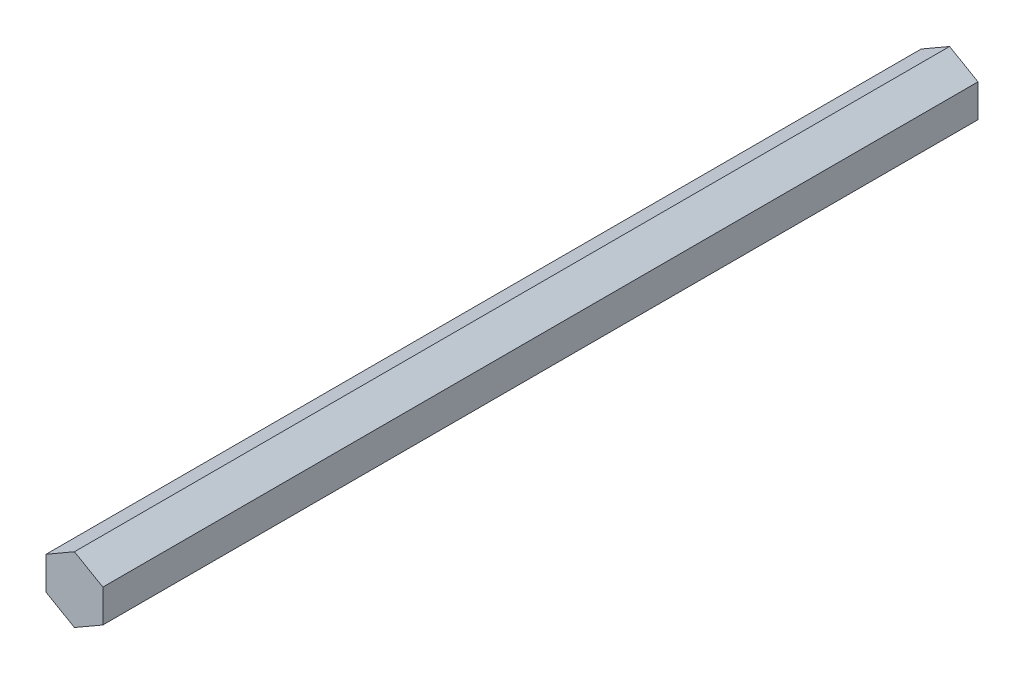
ISO-10303-21;
HEADER;
FILE_DESCRIPTION(('STEP AP214'),'2;1');
FILE_NAME('part.step','',(''),(''),'','','');
FILE_SCHEMA(('AUTOMOTIVE_DESIGN { 1 0 10303 214 1 1 1 1 }'));
ENDSEC;
DATA;
#1=APPLICATION_CONTEXT('core data for automotive mechanical design processes');
#2=APPLICATION_PROTOCOL_DEFINITION('international standard','automotive_design',2000,#1);
#3=PRODUCT_CONTEXT('',#1,'mechanical');
#4=PRODUCT('Part','Part','',(#3));
#5=PRODUCT_RELATED_PRODUCT_CATEGORY('part','',(#4));
#6=PRODUCT_DEFINITION_FORMATION('','',#4);
#7=PRODUCT_DEFINITION_CONTEXT('part definition',#1,'design');
#8=PRODUCT_DEFINITION('design','',#6,#7);
#9=PRODUCT_DEFINITION_SHAPE('','',#8);
#10=(LENGTH_UNIT() NAMED_UNIT(*) SI_UNIT(.MILLI.,.METRE.));
#11=(NAMED_UNIT(*) PLANE_ANGLE_UNIT() SI_UNIT($,.RADIAN.));
#12=(NAMED_UNIT(*) SI_UNIT($,.STERADIAN.) SOLID_ANGLE_UNIT());
#13=UNCERTAINTY_MEASURE_WITH_UNIT(LENGTH_MEASURE(1.E-05),#10,'distance_accuracy_value','');
#14=(GEOMETRIC_REPRESENTATION_CONTEXT(3) GLOBAL_UNCERTAINTY_ASSIGNED_CONTEXT((#13)) GLOBAL_UNIT_ASSIGNED_CONTEXT((#10,
#11,#12)) REPRESENTATION_CONTEXT('',''));
#15=CARTESIAN_POINT('',(0.,0.,0.));
#16=DIRECTION('',(0.,0.,1.));
#17=DIRECTION('',(1.,0.,0.));
#18=AXIS2_PLACEMENT_3D('',#15,#16,#17);
#19=CARTESIAN_POINT('',(1.29903810567665,0.750000000000014,40.));
#20=DIRECTION('',(-0.499999999999995,-0.866025403784442,0.));
#21=DIRECTION('',(0.866025403784442,-0.499999999999995,0.));
#22=AXIS2_PLACEMENT_3D('',#19,#20,#21);
#23=PLANE('',#22);
#24=DIRECTION('',(-0.866025403784442,0.499999999999995,0.));
#25=VECTOR('',#24,1.);
#26=CARTESIAN_POINT('',(1.29903810567665,0.750000000000014,0.));
#27=LINE('',#26,#25);
#28=CARTESIAN_POINT('',(1.29903810567665,0.750000000000014,0.));
#29=VERTEX_POINT('',#28);
#30=CARTESIAN_POINT('',(0.,1.5,0.));
#31=VERTEX_POINT('',#30);
#32=EDGE_CURVE('E123',#29,#31,#27,.T.);
#33=ORIENTED_EDGE('',*,*,#32,.T.);
#34=DIRECTION('',(0.,0.,-1.));
#35=VECTOR('',#34,1.);
#36=CARTESIAN_POINT('',(0.,1.5,40.));
#37=LINE('',#36,#35);
#38=CARTESIAN_POINT('',(0.,1.5,40.));
#39=VERTEX_POINT('',#38);
#40=EDGE_CURVE('E11',#39,#31,#37,.T.);
#41=ORIENTED_EDGE('',*,*,#40,.F.);
#42=DIRECTION('',(-0.866025403784442,0.499999999999995,0.));
#43=VECTOR('',#42,1.);
#44=CARTESIAN_POINT('',(1.29903810567665,0.750000000000014,40.));
#45=LINE('',#44,#43);
#46=CARTESIAN_POINT('',(1.29903810567665,0.750000000000014,40.));
#47=VERTEX_POINT('',#46);
#48=EDGE_CURVE('E133',#47,#39,#45,.T.);
#49=ORIENTED_EDGE('',*,*,#48,.F.);
#50=DIRECTION('',(0.,0.,-1.));
#51=VECTOR('',#50,1.);
#52=CARTESIAN_POINT('',(1.29903810567665,0.750000000000014,40.));
#53=LINE('',#52,#51);
#54=EDGE_CURVE('E119',#47,#29,#53,.T.);
#55=ORIENTED_EDGE('',*,*,#54,.T.);
#56=EDGE_LOOP('',(#33,#41,#49,#55));
#57=FACE_BOUND('',#56,.T.);
#58=ADVANCED_FACE('F39',(#57),#23,.F.);
#59=CARTESIAN_POINT('',(0.,1.5,40.));
#60=DIRECTION('',(0.500000000000001,-0.866025403784438,0.));
#61=DIRECTION('',(0.866025403784438,0.500000000000001,0.));
#62=AXIS2_PLACEMENT_3D('',#59,#60,#61);
#63=PLANE('',#62);
#64=DIRECTION('',(-0.866025403784438,-0.500000000000001,0.));
#65=VECTOR('',#64,1.);
#66=CARTESIAN_POINT('',(0.,1.5,0.));
#67=LINE('',#66,#65);
#68=CARTESIAN_POINT('',(-1.29903810567666,0.749999999999996,0.));
#69=VERTEX_POINT('',#68);
#70=EDGE_CURVE('E126',#31,#69,#67,.T.);
#71=ORIENTED_EDGE('',*,*,#70,.T.);
#72=DIRECTION('',(0.,0.,-1.));
#73=VECTOR('',#72,1.);
#74=CARTESIAN_POINT('',(-1.29903810567666,0.749999999999996,40.));
#75=LINE('',#74,#73);
#76=CARTESIAN_POINT('',(-1.29903810567666,0.749999999999996,40.));
#77=VERTEX_POINT('',#76);
#78=EDGE_CURVE('E47',#77,#69,#75,.T.);
#79=ORIENTED_EDGE('',*,*,#78,.F.);
#80=DIRECTION('',(-0.866025403784438,-0.500000000000001,0.));
#81=VECTOR('',#80,1.);
#82=CARTESIAN_POINT('',(0.,1.5,40.));
#83=LINE('',#82,#81);
#84=EDGE_CURVE('E92',#39,#77,#83,.T.);
#85=ORIENTED_EDGE('',*,*,#84,.F.);
#86=ORIENTED_EDGE('',*,*,#40,.T.);
#87=EDGE_LOOP('',(#71,#79,#85,#86));
#88=FACE_BOUND('',#87,.T.);
#89=ADVANCED_FACE('F157',(#88),#63,.F.);
#90=CARTESIAN_POINT('',(-1.29903810567666,0.749999999999996,40.));
#91=DIRECTION('',(1.,0.,0.));
#92=DIRECTION('',(0.,1.,0.));
#93=AXIS2_PLACEMENT_3D('',#90,#91,#92);
#94=PLANE('',#93);
#95=DIRECTION('',(0.,-1.,0.));
#96=VECTOR('',#95,1.);
#97=CARTESIAN_POINT('',(-1.29903810567666,0.749999999999996,0.));
#98=LINE('',#97,#96);
#99=CARTESIAN_POINT('',(-1.29903810567665,-0.750000000000005,0.));
#100=VERTEX_POINT('',#99);
#101=EDGE_CURVE('E128',#69,#100,#98,.T.);
#102=ORIENTED_EDGE('',*,*,#101,.T.);
#103=DIRECTION('',(0.,0.,-1.));
#104=VECTOR('',#103,1.);
#105=CARTESIAN_POINT('',(-1.29903810567665,-0.750000000000005,40.));
#106=LINE('',#105,#104);
#107=CARTESIAN_POINT('',(-1.29903810567665,-0.750000000000005,40.));
#108=VERTEX_POINT('',#107);
#109=EDGE_CURVE('E114',#108,#100,#106,.T.);
#110=ORIENTED_EDGE('',*,*,#109,.F.);
#111=DIRECTION('',(0.,-1.,0.));
#112=VECTOR('',#111,1.);
#113=CARTESIAN_POINT('',(-1.29903810567666,0.749999999999996,40.));
#114=LINE('',#113,#112);
#115=EDGE_CURVE('E105',#77,#108,#114,.T.);
#116=ORIENTED_EDGE('',*,*,#115,.F.);
#117=ORIENTED_EDGE('',*,*,#78,.T.);
#118=EDGE_LOOP('',(#102,#110,#116,#117));
#119=FACE_BOUND('',#118,.T.);
#120=ADVANCED_FACE('F139',(#119),#94,.F.);
#121=CARTESIAN_POINT('',(-1.29903810567665,-0.750000000000005,40.));
#122=DIRECTION('',(0.499999999999995,0.866025403784442,0.));
#123=DIRECTION('',(-0.866025403784442,0.499999999999995,0.));
#124=AXIS2_PLACEMENT_3D('',#121,#122,#123);
#125=PLANE('',#124);
#126=DIRECTION('',(0.866025403784442,-0.499999999999995,0.));
#127=VECTOR('',#126,1.);
#128=CARTESIAN_POINT('',(-1.29903810567665,-0.750000000000005,0.));
#129=LINE('',#128,#127);
#130=CARTESIAN_POINT('',(0.,-1.5,0.));
#131=VERTEX_POINT('',#130);
#132=EDGE_CURVE('E113',#100,#131,#129,.T.);
#133=ORIENTED_EDGE('',*,*,#132,.T.);
#134=DIRECTION('',(0.,0.,-1.));
#135=VECTOR('',#134,1.);
#136=CARTESIAN_POINT('',(0.,-1.5,40.));
#137=LINE('',#136,#135);
#138=CARTESIAN_POINT('',(0.,-1.5,40.));
#139=VERTEX_POINT('',#138);
#140=EDGE_CURVE('E110',#139,#131,#137,.T.);
#141=ORIENTED_EDGE('',*,*,#140,.F.);
#142=DIRECTION('',(0.866025403784442,-0.499999999999995,0.));
#143=VECTOR('',#142,1.);
#144=CARTESIAN_POINT('',(-1.29903810567665,-0.750000000000005,40.));
#145=LINE('',#144,#143);
#146=EDGE_CURVE('E99',#108,#139,#145,.T.);
#147=ORIENTED_EDGE('',*,*,#146,.F.);
#148=ORIENTED_EDGE('',*,*,#109,.T.);
#149=EDGE_LOOP('',(#133,#141,#147,#148));
#150=FACE_BOUND('',#149,.T.);
#151=ADVANCED_FACE('F111',(#150),#125,.F.);
#152=CARTESIAN_POINT('',(0.,-1.5,40.));
#153=DIRECTION('',(-0.500000000000007,0.866025403784435,0.));
#154=DIRECTION('',(-0.866025403784435,-0.500000000000007,0.));
#155=AXIS2_PLACEMENT_3D('',#152,#153,#154);
#156=PLANE('',#155);
#157=DIRECTION('',(0.866025403784434,0.500000000000007,0.));
#158=VECTOR('',#157,1.);
#159=CARTESIAN_POINT('',(0.,-1.5,0.));
#160=LINE('',#159,#158);
#161=CARTESIAN_POINT('',(1.29903810567666,-0.749999999999987,0.));
#162=VERTEX_POINT('',#161);
#163=EDGE_CURVE('E78',#131,#162,#160,.T.);
#164=ORIENTED_EDGE('',*,*,#163,.T.);
#165=DIRECTION('',(0.,0.,-1.));
#166=VECTOR('',#165,1.);
#167=CARTESIAN_POINT('',(1.29903810567666,-0.749999999999987,40.));
#168=LINE('',#167,#166);
#169=CARTESIAN_POINT('',(1.29903810567666,-0.749999999999987,40.));
#170=VERTEX_POINT('',#169);
#171=EDGE_CURVE('E115',#170,#162,#168,.T.);
#172=ORIENTED_EDGE('',*,*,#171,.F.);
#173=DIRECTION('',(0.866025403784434,0.500000000000007,0.));
#174=VECTOR('',#173,1.);
#175=CARTESIAN_POINT('',(0.,-1.5,40.));
#176=LINE('',#175,#174);
#177=EDGE_CURVE('E103',#139,#170,#176,.T.);
#178=ORIENTED_EDGE('',*,*,#177,.F.);
#179=ORIENTED_EDGE('',*,*,#140,.T.);
#180=EDGE_LOOP('',(#164,#172,#178,#179));
#181=FACE_BOUND('',#180,.T.);
#182=ADVANCED_FACE('F117',(#181),#156,.F.);
#183=CARTESIAN_POINT('',(1.29903810567666,-0.749999999999987,40.));
#184=DIRECTION('',(-1.,0.,0.));
#185=DIRECTION('',(0.,-1.,0.));
#186=AXIS2_PLACEMENT_3D('',#183,#184,#185);
#187=PLANE('',#186);
#188=DIRECTION('',(0.,1.,0.));
#189=VECTOR('',#188,1.);
#190=CARTESIAN_POINT('',(1.29903810567666,-0.749999999999987,0.));
#191=LINE('',#190,#189);
#192=EDGE_CURVE('E84',#162,#29,#191,.T.);
#193=ORIENTED_EDGE('',*,*,#192,.T.);
#194=ORIENTED_EDGE('',*,*,#54,.F.);
#195=DIRECTION('',(0.,1.,0.));
#196=VECTOR('',#195,1.);
#197=CARTESIAN_POINT('',(1.29903810567666,-0.749999999999987,40.));
#198=LINE('',#197,#196);
#199=EDGE_CURVE('E55',#170,#47,#198,.T.);
#200=ORIENTED_EDGE('',*,*,#199,.F.);
#201=ORIENTED_EDGE('',*,*,#171,.T.);
#202=EDGE_LOOP('',(#193,#194,#200,#201));
#203=FACE_BOUND('',#202,.T.);
#204=ADVANCED_FACE('F146',(#203),#187,.F.);
#205=CARTESIAN_POINT('',(0.,0.,40.));
#206=DIRECTION('',(0.,0.,1.));
#207=DIRECTION('',(1.,0.,0.));
#208=AXIS2_PLACEMENT_3D('',#205,#206,#207);
#209=PLANE('',#208);
#210=ORIENTED_EDGE('',*,*,#48,.T.);
#211=ORIENTED_EDGE('',*,*,#84,.T.);
#212=ORIENTED_EDGE('',*,*,#115,.T.);
#213=ORIENTED_EDGE('',*,*,#146,.T.);
#214=ORIENTED_EDGE('',*,*,#177,.T.);
#215=ORIENTED_EDGE('',*,*,#199,.T.);
#216=EDGE_LOOP('',(#210,#211,#212,#213,#214,#215));
#217=FACE_BOUND('',#216,.T.);
#218=ADVANCED_FACE('F101',(#217),#209,.T.);
#219=CARTESIAN_POINT('',(0.,0.,0.));
#220=DIRECTION('',(0.,0.,1.));
#221=DIRECTION('',(1.,0.,0.));
#222=AXIS2_PLACEMENT_3D('',#219,#220,#221);
#223=PLANE('',#222);
#224=ORIENTED_EDGE('',*,*,#32,.F.);
#225=ORIENTED_EDGE('',*,*,#192,.F.);
#226=ORIENTED_EDGE('',*,*,#163,.F.);
#227=ORIENTED_EDGE('',*,*,#132,.F.);
#228=ORIENTED_EDGE('',*,*,#101,.F.);
#229=ORIENTED_EDGE('',*,*,#70,.F.);
#230=EDGE_LOOP('',(#224,#225,#226,#227,#228,#229));
#231=FACE_BOUND('',#230,.T.);
#232=ADVANCED_FACE('F142',(#231),#223,.F.);
#233=CLOSED_SHELL('',(#58,#89,#120,#151,#182,#204,#218,#232));
#234=MANIFOLD_SOLID_BREP('B2',#233);
#235=ADVANCED_BREP_SHAPE_REPRESENTATION('',(#18,#234),#14);
#236=SHAPE_DEFINITION_REPRESENTATION(#9,#235);
ENDSEC;
END-ISO-10303-21;
